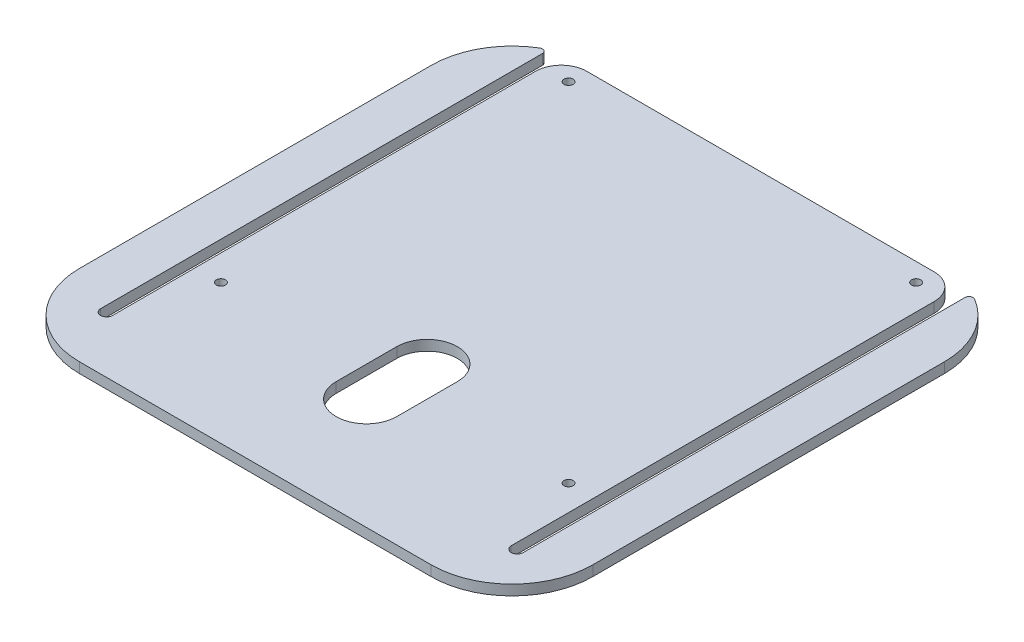
ISO-10303-21;
HEADER;
FILE_DESCRIPTION(('STEP AP214'),'2;1');
FILE_NAME('part.step','',(''),(''),'','','');
FILE_SCHEMA(('AUTOMOTIVE_DESIGN { 1 0 10303 214 1 1 1 1 }'));
ENDSEC;
DATA;
#1=APPLICATION_CONTEXT('core data for automotive mechanical design processes');
#2=APPLICATION_PROTOCOL_DEFINITION('international standard','automotive_design',2000,#1);
#3=PRODUCT_CONTEXT('',#1,'mechanical');
#4=PRODUCT('Part','Part','',(#3));
#5=PRODUCT_RELATED_PRODUCT_CATEGORY('part','',(#4));
#6=PRODUCT_DEFINITION_FORMATION('','',#4);
#7=PRODUCT_DEFINITION_CONTEXT('part definition',#1,'design');
#8=PRODUCT_DEFINITION('design','',#6,#7);
#9=PRODUCT_DEFINITION_SHAPE('','',#8);
#10=(LENGTH_UNIT() NAMED_UNIT(*) SI_UNIT(.MILLI.,.METRE.));
#11=(NAMED_UNIT(*) PLANE_ANGLE_UNIT() SI_UNIT($,.RADIAN.));
#12=(NAMED_UNIT(*) SI_UNIT($,.STERADIAN.) SOLID_ANGLE_UNIT());
#13=UNCERTAINTY_MEASURE_WITH_UNIT(LENGTH_MEASURE(1.E-05),#10,'distance_accuracy_value','');
#14=(GEOMETRIC_REPRESENTATION_CONTEXT(3) GLOBAL_UNCERTAINTY_ASSIGNED_CONTEXT((#13)) GLOBAL_UNIT_ASSIGNED_CONTEXT((#10,
#11,#12)) REPRESENTATION_CONTEXT('',''));
#15=CARTESIAN_POINT('',(0.,0.,0.));
#16=DIRECTION('',(0.,0.,1.));
#17=DIRECTION('',(1.,0.,0.));
#18=AXIS2_PLACEMENT_3D('',#15,#16,#17);
#19=CARTESIAN_POINT('',(0.,2.54,0.));
#20=DIRECTION('',(0.,0.,-1.));
#21=DIRECTION('',(-1.,0.,0.));
#22=AXIS2_PLACEMENT_3D('',#19,#20,#21);
#23=PLANE('',#22);
#24=DIRECTION('',(1.,0.,0.));
#25=VECTOR('',#24,1.);
#26=CARTESIAN_POINT('',(0.,0.,0.));
#27=LINE('',#26,#25);
#28=CARTESIAN_POINT('',(20.525,0.,0.));
#29=VERTEX_POINT('',#28);
#30=CARTESIAN_POINT('',(106.475,0.,0.));
#31=VERTEX_POINT('',#30);
#32=EDGE_CURVE('E283',#29,#31,#27,.T.);
#33=ORIENTED_EDGE('',*,*,#32,.F.);
#34=DIRECTION('',(0.,-1.,0.));
#35=VECTOR('',#34,1.);
#36=CARTESIAN_POINT('',(20.525,2.54,0.));
#37=LINE('',#36,#35);
#38=CARTESIAN_POINT('',(20.525,2.54,0.));
#39=VERTEX_POINT('',#38);
#40=EDGE_CURVE('E401',#29,#39,#37,.F.);
#41=ORIENTED_EDGE('',*,*,#40,.T.);
#42=DIRECTION('',(1.,0.,0.));
#43=VECTOR('',#42,1.);
#44=CARTESIAN_POINT('',(0.,2.54,0.));
#45=LINE('',#44,#43);
#46=CARTESIAN_POINT('',(106.475,2.54,0.));
#47=VERTEX_POINT('',#46);
#48=EDGE_CURVE('E232',#39,#47,#45,.T.);
#49=ORIENTED_EDGE('',*,*,#48,.T.);
#50=DIRECTION('',(0.,-1.,0.));
#51=VECTOR('',#50,1.);
#52=CARTESIAN_POINT('',(106.475,2.54,0.));
#53=LINE('',#52,#51);
#54=EDGE_CURVE('E397',#47,#31,#53,.T.);
#55=ORIENTED_EDGE('',*,*,#54,.T.);
#56=EDGE_LOOP('',(#33,#41,#49,#55));
#57=FACE_BOUND('',#56,.T.);
#58=ADVANCED_FACE('F48',(#57),#23,.T.);
#59=CARTESIAN_POINT('',(14.175,2.54,0.));
#60=DIRECTION('',(1.,0.,0.));
#61=DIRECTION('',(0.,0.,-1.));
#62=AXIS2_PLACEMENT_3D('',#59,#60,#61);
#63=PLANE('',#62);
#64=DIRECTION('',(0.,0.,1.));
#65=VECTOR('',#64,1.);
#66=CARTESIAN_POINT('',(14.175,2.54,0.));
#67=LINE('',#66,#65);
#68=CARTESIAN_POINT('',(14.175,2.54,6.35));
#69=VERTEX_POINT('',#68);
#70=CARTESIAN_POINT('',(14.175,2.54,111.));
#71=VERTEX_POINT('',#70);
#72=EDGE_CURVE('E236',#69,#71,#67,.T.);
#73=ORIENTED_EDGE('',*,*,#72,.F.);
#74=DIRECTION('',(0.,-1.,0.));
#75=VECTOR('',#74,1.);
#76=CARTESIAN_POINT('',(14.175,0.,6.35));
#77=LINE('',#76,#75);
#78=CARTESIAN_POINT('',(14.175,0.,6.35));
#79=VERTEX_POINT('',#78);
#80=EDGE_CURVE('E387',#69,#79,#77,.T.);
#81=ORIENTED_EDGE('',*,*,#80,.T.);
#82=DIRECTION('',(0.,0.,1.));
#83=VECTOR('',#82,1.);
#84=CARTESIAN_POINT('',(14.175,0.,0.));
#85=LINE('',#84,#83);
#86=CARTESIAN_POINT('',(14.175,0.,111.));
#87=VERTEX_POINT('',#86);
#88=EDGE_CURVE('E287',#79,#87,#85,.T.);
#89=ORIENTED_EDGE('',*,*,#88,.T.);
#90=DIRECTION('',(0.,-1.,0.));
#91=VECTOR('',#90,1.);
#92=CARTESIAN_POINT('',(14.175,2.54,111.));
#93=LINE('',#92,#91);
#94=EDGE_CURVE('E329',#71,#87,#93,.T.);
#95=ORIENTED_EDGE('',*,*,#94,.F.);
#96=EDGE_LOOP('',(#73,#81,#89,#95));
#97=FACE_BOUND('',#96,.T.);
#98=ADVANCED_FACE('F500',(#97),#63,.F.);
#99=CARTESIAN_POINT('',(12.7,2.54,111.));
#100=DIRECTION('',(0.,-1.,0.));
#101=DIRECTION('',(0.,0.,-1.));
#102=AXIS2_PLACEMENT_3D('',#99,#100,#101);
#103=CYLINDRICAL_SURFACE('',#102,1.475);
#104=CARTESIAN_POINT('',(12.7,0.,111.));
#105=DIRECTION('',(0.,1.,0.));
#106=DIRECTION('',(0.,0.,1.));
#107=AXIS2_PLACEMENT_3D('',#104,#105,#106);
#108=CIRCLE('',#107,1.475);
#109=CARTESIAN_POINT('',(11.225,0.,111.));
#110=VERTEX_POINT('',#109);
#111=EDGE_CURVE('E290',#110,#87,#108,.T.);
#112=ORIENTED_EDGE('',*,*,#111,.F.);
#113=DIRECTION('',(0.,-1.,0.));
#114=VECTOR('',#113,1.);
#115=CARTESIAN_POINT('',(11.225,2.54,111.));
#116=LINE('',#115,#114);
#117=CARTESIAN_POINT('',(11.225,2.54,111.));
#118=VERTEX_POINT('',#117);
#119=EDGE_CURVE('E325',#118,#110,#116,.T.);
#120=ORIENTED_EDGE('',*,*,#119,.F.);
#121=CARTESIAN_POINT('',(12.7,2.54,111.));
#122=DIRECTION('',(0.,1.,0.));
#123=DIRECTION('',(0.,0.,1.));
#124=AXIS2_PLACEMENT_3D('',#121,#122,#123);
#125=CIRCLE('',#124,1.475);
#126=EDGE_CURVE('E239',#118,#71,#125,.T.);
#127=ORIENTED_EDGE('',*,*,#126,.T.);
#128=ORIENTED_EDGE('',*,*,#94,.T.);
#129=EDGE_LOOP('',(#112,#120,#127,#128));
#130=FACE_BOUND('',#129,.T.);
#131=ADVANCED_FACE('F506',(#130),#103,.F.);
#132=CARTESIAN_POINT('',(11.225,2.54,0.));
#133=DIRECTION('',(1.,0.,0.));
#134=DIRECTION('',(0.,0.,-1.));
#135=AXIS2_PLACEMENT_3D('',#132,#133,#134);
#136=PLANE('',#135);
#137=DIRECTION('',(0.,0.,1.));
#138=VECTOR('',#137,1.);
#139=CARTESIAN_POINT('',(11.225,0.,0.));
#140=LINE('',#139,#138);
#141=CARTESIAN_POINT('',(11.225,0.,1.67956617456544));
#142=VERTEX_POINT('',#141);
#143=EDGE_CURVE('E294',#142,#110,#140,.T.);
#144=ORIENTED_EDGE('',*,*,#143,.F.);
#145=DIRECTION('',(0.,-1.,0.));
#146=VECTOR('',#145,1.);
#147=CARTESIAN_POINT('',(11.225,2.54,1.67956617456544));
#148=LINE('',#147,#146);
#149=CARTESIAN_POINT('',(11.225,2.54,1.67956617456544));
#150=VERTEX_POINT('',#149);
#151=EDGE_CURVE('E11',#142,#150,#148,.F.);
#152=ORIENTED_EDGE('',*,*,#151,.T.);
#153=DIRECTION('',(0.,0.,1.));
#154=VECTOR('',#153,1.);
#155=CARTESIAN_POINT('',(11.225,2.54,0.));
#156=LINE('',#155,#154);
#157=EDGE_CURVE('E243',#150,#118,#156,.T.);
#158=ORIENTED_EDGE('',*,*,#157,.T.);
#159=ORIENTED_EDGE('',*,*,#119,.T.);
#160=EDGE_LOOP('',(#144,#152,#158,#159));
#161=FACE_BOUND('',#160,.T.);
#162=ADVANCED_FACE('F507',(#161),#136,.T.);
#163=CARTESIAN_POINT('',(0.,2.54,0.));
#164=DIRECTION('',(1.,0.,0.));
#165=DIRECTION('',(0.,0.,-1.));
#166=AXIS2_PLACEMENT_3D('',#163,#164,#165);
#167=PLANE('',#166);
#168=DIRECTION('',(0.,0.,1.));
#169=VECTOR('',#168,1.);
#170=CARTESIAN_POINT('',(0.,2.54,0.));
#171=LINE('',#170,#169);
#172=CARTESIAN_POINT('',(0.,2.54,17.9721833676379));
#173=VERTEX_POINT('',#172);
#174=CARTESIAN_POINT('',(0.,2.54,105.));
#175=VERTEX_POINT('',#174);
#176=EDGE_CURVE('E246',#173,#175,#171,.T.);
#177=ORIENTED_EDGE('',*,*,#176,.F.);
#178=DIRECTION('',(0.,-1.,0.));
#179=VECTOR('',#178,1.);
#180=CARTESIAN_POINT('',(0.,2.54,17.9721833676379));
#181=LINE('',#180,#179);
#182=CARTESIAN_POINT('',(0.,0.,17.9721833676379));
#183=VERTEX_POINT('',#182);
#184=EDGE_CURVE('E343',#173,#183,#181,.T.);
#185=ORIENTED_EDGE('',*,*,#184,.T.);
#186=DIRECTION('',(0.,0.,1.));
#187=VECTOR('',#186,1.);
#188=CARTESIAN_POINT('',(0.,0.,0.));
#189=LINE('',#188,#187);
#190=CARTESIAN_POINT('',(0.,0.,105.));
#191=VERTEX_POINT('',#190);
#192=EDGE_CURVE('E297',#183,#191,#189,.T.);
#193=ORIENTED_EDGE('',*,*,#192,.T.);
#194=DIRECTION('',(0.,-1.,0.));
#195=VECTOR('',#194,1.);
#196=CARTESIAN_POINT('',(0.,2.54,105.));
#197=LINE('',#196,#195);
#198=EDGE_CURVE('E333',#191,#175,#197,.F.);
#199=ORIENTED_EDGE('',*,*,#198,.T.);
#200=EDGE_LOOP('',(#177,#185,#193,#199));
#201=FACE_BOUND('',#200,.T.);
#202=ADVANCED_FACE('F445',(#201),#167,.F.);
#203=CARTESIAN_POINT('',(0.,2.54,125.));
#204=DIRECTION('',(0.,0.,-1.));
#205=DIRECTION('',(-1.,0.,0.));
#206=AXIS2_PLACEMENT_3D('',#203,#204,#205);
#207=PLANE('',#206);
#208=DIRECTION('',(1.,0.,0.));
#209=VECTOR('',#208,1.);
#210=CARTESIAN_POINT('',(0.,0.,125.));
#211=LINE('',#210,#209);
#212=CARTESIAN_POINT('',(20.,0.,125.));
#213=VERTEX_POINT('',#212);
#214=CARTESIAN_POINT('',(107.,0.,125.));
#215=VERTEX_POINT('',#214);
#216=EDGE_CURVE('E301',#213,#215,#211,.T.);
#217=ORIENTED_EDGE('',*,*,#216,.T.);
#218=DIRECTION('',(0.,-1.,0.));
#219=VECTOR('',#218,1.);
#220=CARTESIAN_POINT('',(107.,2.54,125.));
#221=LINE('',#220,#219);
#222=CARTESIAN_POINT('',(107.,2.54,125.));
#223=VERTEX_POINT('',#222);
#224=EDGE_CURVE('E384',#215,#223,#221,.F.);
#225=ORIENTED_EDGE('',*,*,#224,.T.);
#226=DIRECTION('',(1.,0.,0.));
#227=VECTOR('',#226,1.);
#228=CARTESIAN_POINT('',(0.,2.54,125.));
#229=LINE('',#228,#227);
#230=CARTESIAN_POINT('',(20.,2.54,125.));
#231=VERTEX_POINT('',#230);
#232=EDGE_CURVE('E250',#231,#223,#229,.T.);
#233=ORIENTED_EDGE('',*,*,#232,.F.);
#234=DIRECTION('',(0.,-1.,0.));
#235=VECTOR('',#234,1.);
#236=CARTESIAN_POINT('',(20.,2.54,125.));
#237=LINE('',#236,#235);
#238=EDGE_CURVE('E380',#231,#213,#237,.T.);
#239=ORIENTED_EDGE('',*,*,#238,.T.);
#240=EDGE_LOOP('',(#217,#225,#233,#239));
#241=FACE_BOUND('',#240,.T.);
#242=ADVANCED_FACE('F453',(#241),#207,.F.);
#243=CARTESIAN_POINT('',(127.,2.54,0.));
#244=DIRECTION('',(1.,0.,0.));
#245=DIRECTION('',(0.,0.,-1.));
#246=AXIS2_PLACEMENT_3D('',#243,#244,#245);
#247=PLANE('',#246);
#248=DIRECTION('',(0.,0.,1.));
#249=VECTOR('',#248,1.);
#250=CARTESIAN_POINT('',(127.,0.,0.));
#251=LINE('',#250,#249);
#252=CARTESIAN_POINT('',(127.,0.,17.9721833676379));
#253=VERTEX_POINT('',#252);
#254=CARTESIAN_POINT('',(127.,0.,105.));
#255=VERTEX_POINT('',#254);
#256=EDGE_CURVE('E305',#253,#255,#251,.T.);
#257=ORIENTED_EDGE('',*,*,#256,.F.);
#258=DIRECTION('',(0.,1.,0.));
#259=VECTOR('',#258,1.);
#260=CARTESIAN_POINT('',(127.,2.54,17.9721833676379));
#261=LINE('',#260,#259);
#262=CARTESIAN_POINT('',(127.,2.54,17.9721833676379));
#263=VERTEX_POINT('',#262);
#264=EDGE_CURVE('E377',#253,#263,#261,.T.);
#265=ORIENTED_EDGE('',*,*,#264,.T.);
#266=DIRECTION('',(0.,0.,1.));
#267=VECTOR('',#266,1.);
#268=CARTESIAN_POINT('',(127.,2.54,0.));
#269=LINE('',#268,#267);
#270=CARTESIAN_POINT('',(127.,2.54,105.));
#271=VERTEX_POINT('',#270);
#272=EDGE_CURVE('E254',#263,#271,#269,.T.);
#273=ORIENTED_EDGE('',*,*,#272,.T.);
#274=DIRECTION('',(0.,-1.,0.));
#275=VECTOR('',#274,1.);
#276=CARTESIAN_POINT('',(127.,0.,105.));
#277=LINE('',#276,#275);
#278=EDGE_CURVE('E373',#271,#255,#277,.T.);
#279=ORIENTED_EDGE('',*,*,#278,.T.);
#280=EDGE_LOOP('',(#257,#265,#273,#279));
#281=FACE_BOUND('',#280,.T.);
#282=ADVANCED_FACE('F462',(#281),#247,.T.);
#283=CARTESIAN_POINT('',(115.775,2.54,0.));
#284=DIRECTION('',(1.,0.,0.));
#285=DIRECTION('',(0.,0.,-1.));
#286=AXIS2_PLACEMENT_3D('',#283,#284,#285);
#287=PLANE('',#286);
#288=DIRECTION('',(0.,0.,1.));
#289=VECTOR('',#288,1.);
#290=CARTESIAN_POINT('',(115.775,2.54,0.));
#291=LINE('',#290,#289);
#292=CARTESIAN_POINT('',(115.775,2.54,1.67956617456544));
#293=VERTEX_POINT('',#292);
#294=CARTESIAN_POINT('',(115.775,2.54,111.));
#295=VERTEX_POINT('',#294);
#296=EDGE_CURVE('E258',#293,#295,#291,.T.);
#297=ORIENTED_EDGE('',*,*,#296,.F.);
#298=DIRECTION('',(0.,1.,0.));
#299=VECTOR('',#298,1.);
#300=CARTESIAN_POINT('',(115.775,0.,1.67956617456544));
#301=LINE('',#300,#299);
#302=CARTESIAN_POINT('',(115.775,0.,1.67956617456544));
#303=VERTEX_POINT('',#302);
#304=EDGE_CURVE('E413',#293,#303,#301,.F.);
#305=ORIENTED_EDGE('',*,*,#304,.T.);
#306=DIRECTION('',(0.,0.,1.));
#307=VECTOR('',#306,1.);
#308=CARTESIAN_POINT('',(115.775,0.,0.));
#309=LINE('',#308,#307);
#310=CARTESIAN_POINT('',(115.775,0.,111.));
#311=VERTEX_POINT('',#310);
#312=EDGE_CURVE('E309',#303,#311,#309,.T.);
#313=ORIENTED_EDGE('',*,*,#312,.T.);
#314=DIRECTION('',(0.,-1.,0.));
#315=VECTOR('',#314,1.);
#316=CARTESIAN_POINT('',(115.775,2.54,111.));
#317=LINE('',#316,#315);
#318=EDGE_CURVE('E321',#295,#311,#317,.T.);
#319=ORIENTED_EDGE('',*,*,#318,.F.);
#320=EDGE_LOOP('',(#297,#305,#313,#319));
#321=FACE_BOUND('',#320,.T.);
#322=ADVANCED_FACE('F474',(#321),#287,.F.);
#323=CARTESIAN_POINT('',(114.3,2.54,111.));
#324=DIRECTION('',(0.,-1.,0.));
#325=DIRECTION('',(0.,0.,-1.));
#326=AXIS2_PLACEMENT_3D('',#323,#324,#325);
#327=CYLINDRICAL_SURFACE('',#326,1.47500000000002);
#328=CARTESIAN_POINT('',(114.3,0.,111.));
#329=DIRECTION('',(0.,1.,0.));
#330=DIRECTION('',(0.,0.,1.));
#331=AXIS2_PLACEMENT_3D('',#328,#329,#330);
#332=CIRCLE('',#331,1.47500000000002);
#333=CARTESIAN_POINT('',(112.825,0.,111.));
#334=VERTEX_POINT('',#333);
#335=EDGE_CURVE('E312',#334,#311,#332,.T.);
#336=ORIENTED_EDGE('',*,*,#335,.F.);
#337=DIRECTION('',(0.,-1.,0.));
#338=VECTOR('',#337,1.);
#339=CARTESIAN_POINT('',(112.825,2.54,111.));
#340=LINE('',#339,#338);
#341=CARTESIAN_POINT('',(112.825,2.54,111.));
#342=VERTEX_POINT('',#341);
#343=EDGE_CURVE('E209',#342,#334,#340,.T.);
#344=ORIENTED_EDGE('',*,*,#343,.F.);
#345=CARTESIAN_POINT('',(114.3,2.54,111.));
#346=DIRECTION('',(0.,1.,0.));
#347=DIRECTION('',(0.,0.,1.));
#348=AXIS2_PLACEMENT_3D('',#345,#346,#347);
#349=CIRCLE('',#348,1.47500000000002);
#350=EDGE_CURVE('E261',#342,#295,#349,.T.);
#351=ORIENTED_EDGE('',*,*,#350,.T.);
#352=ORIENTED_EDGE('',*,*,#318,.T.);
#353=EDGE_LOOP('',(#336,#344,#351,#352));
#354=FACE_BOUND('',#353,.T.);
#355=ADVANCED_FACE('F480',(#354),#327,.F.);
#356=CARTESIAN_POINT('',(56.,2.54,0.));
#357=DIRECTION('',(1.,0.,0.));
#358=DIRECTION('',(0.,0.,-1.));
#359=AXIS2_PLACEMENT_3D('',#356,#357,#358);
#360=PLANE('',#359);
#361=DIRECTION('',(0.,0.,1.));
#362=VECTOR('',#361,1.);
#363=CARTESIAN_POINT('',(56.,0.,0.));
#364=LINE('',#363,#362);
#365=CARTESIAN_POINT('',(56.,0.,82.5));
#366=VERTEX_POINT('',#365);
#367=CARTESIAN_POINT('',(56.,0.,97.5));
#368=VERTEX_POINT('',#367);
#369=EDGE_CURVE('E203',#366,#368,#364,.T.);
#370=ORIENTED_EDGE('',*,*,#369,.F.);
#371=DIRECTION('',(0.,-1.,0.));
#372=VECTOR('',#371,1.);
#373=CARTESIAN_POINT('',(56.,2.54,82.5));
#374=LINE('',#373,#372);
#375=CARTESIAN_POINT('',(56.,2.54,82.5));
#376=VERTEX_POINT('',#375);
#377=EDGE_CURVE('E197',#376,#366,#374,.T.);
#378=ORIENTED_EDGE('',*,*,#377,.F.);
#379=DIRECTION('',(0.,0.,1.));
#380=VECTOR('',#379,1.);
#381=CARTESIAN_POINT('',(56.,2.54,0.));
#382=LINE('',#381,#380);
#383=CARTESIAN_POINT('',(56.,2.54,97.5));
#384=VERTEX_POINT('',#383);
#385=EDGE_CURVE('E200',#376,#384,#382,.T.);
#386=ORIENTED_EDGE('',*,*,#385,.T.);
#387=DIRECTION('',(0.,-1.,0.));
#388=VECTOR('',#387,1.);
#389=CARTESIAN_POINT('',(56.,2.54,97.5));
#390=LINE('',#389,#388);
#391=EDGE_CURVE('E268',#384,#368,#390,.T.);
#392=ORIENTED_EDGE('',*,*,#391,.T.);
#393=EDGE_LOOP('',(#370,#378,#386,#392));
#394=FACE_BOUND('',#393,.T.);
#395=ADVANCED_FACE('F199',(#394),#360,.T.);
#396=CARTESIAN_POINT('',(63.5,2.54,82.5));
#397=DIRECTION('',(0.,-1.,0.));
#398=DIRECTION('',(0.,0.,-1.));
#399=AXIS2_PLACEMENT_3D('',#396,#397,#398);
#400=CYLINDRICAL_SURFACE('',#399,7.50000000000001);
#401=CARTESIAN_POINT('',(63.5,0.,82.5));
#402=DIRECTION('',(0.,1.,0.));
#403=DIRECTION('',(0.,0.,1.));
#404=AXIS2_PLACEMENT_3D('',#401,#402,#403);
#405=CIRCLE('',#404,7.50000000000001);
#406=CARTESIAN_POINT('',(71.,0.,82.5));
#407=VERTEX_POINT('',#406);
#408=EDGE_CURVE('E271',#407,#366,#405,.T.);
#409=ORIENTED_EDGE('',*,*,#408,.F.);
#410=DIRECTION('',(0.,-1.,0.));
#411=VECTOR('',#410,1.);
#412=CARTESIAN_POINT('',(71.,2.54,82.5));
#413=LINE('',#412,#411);
#414=CARTESIAN_POINT('',(71.,2.54,82.5));
#415=VERTEX_POINT('',#414);
#416=EDGE_CURVE('E210',#415,#407,#413,.T.);
#417=ORIENTED_EDGE('',*,*,#416,.F.);
#418=CARTESIAN_POINT('',(63.5,2.54,82.5));
#419=DIRECTION('',(0.,1.,0.));
#420=DIRECTION('',(0.,0.,1.));
#421=AXIS2_PLACEMENT_3D('',#418,#419,#420);
#422=CIRCLE('',#421,7.50000000000001);
#423=EDGE_CURVE('E215',#415,#376,#422,.T.);
#424=ORIENTED_EDGE('',*,*,#423,.T.);
#425=ORIENTED_EDGE('',*,*,#377,.T.);
#426=EDGE_LOOP('',(#409,#417,#424,#425));
#427=FACE_BOUND('',#426,.T.);
#428=ADVANCED_FACE('F221',(#427),#400,.F.);
#429=CARTESIAN_POINT('',(71.,2.54,0.));
#430=DIRECTION('',(1.,0.,0.));
#431=DIRECTION('',(0.,0.,-1.));
#432=AXIS2_PLACEMENT_3D('',#429,#430,#431);
#433=PLANE('',#432);
#434=DIRECTION('',(0.,0.,1.));
#435=VECTOR('',#434,1.);
#436=CARTESIAN_POINT('',(71.,0.,0.));
#437=LINE('',#436,#435);
#438=CARTESIAN_POINT('',(71.,0.,97.5));
#439=VERTEX_POINT('',#438);
#440=EDGE_CURVE('E275',#407,#439,#437,.T.);
#441=ORIENTED_EDGE('',*,*,#440,.T.);
#442=DIRECTION('',(0.,-1.,0.));
#443=VECTOR('',#442,1.);
#444=CARTESIAN_POINT('',(71.,2.54,97.5));
#445=LINE('',#444,#443);
#446=CARTESIAN_POINT('',(71.,2.54,97.5));
#447=VERTEX_POINT('',#446);
#448=EDGE_CURVE('E336',#447,#439,#445,.T.);
#449=ORIENTED_EDGE('',*,*,#448,.F.);
#450=DIRECTION('',(0.,0.,1.));
#451=VECTOR('',#450,1.);
#452=CARTESIAN_POINT('',(71.,2.54,0.));
#453=LINE('',#452,#451);
#454=EDGE_CURVE('E224',#415,#447,#453,.T.);
#455=ORIENTED_EDGE('',*,*,#454,.F.);
#456=ORIENTED_EDGE('',*,*,#416,.T.);
#457=EDGE_LOOP('',(#441,#449,#455,#456));
#458=FACE_BOUND('',#457,.T.);
#459=ADVANCED_FACE('F530',(#458),#433,.F.);
#460=CARTESIAN_POINT('',(112.825,2.54,0.));
#461=DIRECTION('',(1.,0.,0.));
#462=DIRECTION('',(0.,0.,-1.));
#463=AXIS2_PLACEMENT_3D('',#460,#461,#462);
#464=PLANE('',#463);
#465=DIRECTION('',(0.,0.,1.));
#466=VECTOR('',#465,1.);
#467=CARTESIAN_POINT('',(112.825,0.,0.));
#468=LINE('',#467,#466);
#469=CARTESIAN_POINT('',(112.825,0.,6.35));
#470=VERTEX_POINT('',#469);
#471=EDGE_CURVE('E219',#470,#334,#468,.T.);
#472=ORIENTED_EDGE('',*,*,#471,.F.);
#473=DIRECTION('',(0.,-1.,0.));
#474=VECTOR('',#473,1.);
#475=CARTESIAN_POINT('',(112.825,2.54,6.35));
#476=LINE('',#475,#474);
#477=CARTESIAN_POINT('',(112.825,2.54,6.35));
#478=VERTEX_POINT('',#477);
#479=EDGE_CURVE('E410',#470,#478,#476,.F.);
#480=ORIENTED_EDGE('',*,*,#479,.T.);
#481=DIRECTION('',(0.,0.,1.));
#482=VECTOR('',#481,1.);
#483=CARTESIAN_POINT('',(112.825,2.54,0.));
#484=LINE('',#483,#482);
#485=EDGE_CURVE('E265',#478,#342,#484,.T.);
#486=ORIENTED_EDGE('',*,*,#485,.T.);
#487=ORIENTED_EDGE('',*,*,#343,.T.);
#488=EDGE_LOOP('',(#472,#480,#486,#487));
#489=FACE_BOUND('',#488,.T.);
#490=ADVANCED_FACE('F528',(#489),#464,.T.);
#491=CARTESIAN_POINT('',(63.5,2.54,97.5));
#492=DIRECTION('',(0.,-1.,0.));
#493=DIRECTION('',(0.,0.,-1.));
#494=AXIS2_PLACEMENT_3D('',#491,#492,#493);
#495=CYLINDRICAL_SURFACE('',#494,7.50000000000001);
#496=CARTESIAN_POINT('',(63.5,0.,97.5));
#497=DIRECTION('',(0.,1.,0.));
#498=DIRECTION('',(0.,0.,1.));
#499=AXIS2_PLACEMENT_3D('',#496,#497,#498);
#500=CIRCLE('',#499,7.50000000000001);
#501=EDGE_CURVE('E279',#368,#439,#500,.T.);
#502=ORIENTED_EDGE('',*,*,#501,.F.);
#503=ORIENTED_EDGE('',*,*,#391,.F.);
#504=CARTESIAN_POINT('',(63.5,2.54,97.5));
#505=DIRECTION('',(0.,1.,0.));
#506=DIRECTION('',(0.,0.,1.));
#507=AXIS2_PLACEMENT_3D('',#504,#505,#506);
#508=CIRCLE('',#507,7.50000000000001);
#509=EDGE_CURVE('E217',#384,#447,#508,.T.);
#510=ORIENTED_EDGE('',*,*,#509,.T.);
#511=ORIENTED_EDGE('',*,*,#448,.T.);
#512=EDGE_LOOP('',(#502,#503,#510,#511));
#513=FACE_BOUND('',#512,.T.);
#514=ADVANCED_FACE('F525',(#513),#495,.F.);
#515=CARTESIAN_POINT('',(0.,2.54,0.));
#516=DIRECTION('',(0.,1.,0.));
#517=DIRECTION('',(0.,0.,1.));
#518=AXIS2_PLACEMENT_3D('',#515,#516,#517);
#519=PLANE('',#518);
#520=CARTESIAN_POINT('',(106.5,2.54,4.5));
#521=DIRECTION('',(0.,1.,0.));
#522=DIRECTION('',(0.,0.,1.));
#523=AXIS2_PLACEMENT_3D('',#520,#521,#522);
#524=CIRCLE('',#523,1.1303);
#525=CARTESIAN_POINT('',(106.5,2.54,5.6303));
#526=VERTEX_POINT('',#525);
#527=EDGE_CURVE('E855',#526,#526,#524,.T.);
#528=ORIENTED_EDGE('',*,*,#527,.F.);
#529=EDGE_LOOP('',(#528));
#530=FACE_BOUND('',#529,.T.);
#531=CARTESIAN_POINT('',(20.5,2.54,4.5));
#532=DIRECTION('',(0.,1.,0.));
#533=DIRECTION('',(0.,0.,1.));
#534=AXIS2_PLACEMENT_3D('',#531,#532,#533);
#535=CIRCLE('',#534,1.1303);
#536=CARTESIAN_POINT('',(20.5,2.54,5.6303));
#537=VERTEX_POINT('',#536);
#538=EDGE_CURVE('E859',#537,#537,#535,.T.);
#539=ORIENTED_EDGE('',*,*,#538,.F.);
#540=EDGE_LOOP('',(#539));
#541=FACE_BOUND('',#540,.T.);
#542=CARTESIAN_POINT('',(106.5,2.54,90.5));
#543=DIRECTION('',(0.,1.,0.));
#544=DIRECTION('',(0.,0.,1.));
#545=AXIS2_PLACEMENT_3D('',#542,#543,#544);
#546=CIRCLE('',#545,1.1303);
#547=CARTESIAN_POINT('',(106.5,2.54,91.6303));
#548=VERTEX_POINT('',#547);
#549=EDGE_CURVE('E869',#548,#548,#546,.T.);
#550=ORIENTED_EDGE('',*,*,#549,.F.);
#551=EDGE_LOOP('',(#550));
#552=FACE_BOUND('',#551,.T.);
#553=CARTESIAN_POINT('',(20.5,2.54,90.5));
#554=DIRECTION('',(0.,1.,0.));
#555=DIRECTION('',(0.,0.,1.));
#556=AXIS2_PLACEMENT_3D('',#553,#554,#555);
#557=CIRCLE('',#556,1.1303);
#558=CARTESIAN_POINT('',(20.5,2.54,91.6303));
#559=VERTEX_POINT('',#558);
#560=EDGE_CURVE('E877',#559,#559,#557,.T.);
#561=ORIENTED_EDGE('',*,*,#560,.F.);
#562=EDGE_LOOP('',(#561));
#563=FACE_BOUND('',#562,.T.);
#564=ORIENTED_EDGE('',*,*,#385,.F.);
#565=ORIENTED_EDGE('',*,*,#423,.F.);
#566=ORIENTED_EDGE('',*,*,#454,.T.);
#567=ORIENTED_EDGE('',*,*,#509,.F.);
#568=EDGE_LOOP('',(#564,#565,#566,#567));
#569=FACE_BOUND('',#568,.T.);
#570=CARTESIAN_POINT('',(107.,2.54,17.9721833676379));
#571=DIRECTION('',(0.,1.,0.));
#572=DIRECTION('',(0.,0.,1.));
#573=AXIS2_PLACEMENT_3D('',#570,#571,#572);
#574=CIRCLE('',#573,20.);
#575=CARTESIAN_POINT('',(117.289473684211,2.54,0.822060006508994));
#576=VERTEX_POINT('',#575);
#577=EDGE_CURVE('E366',#263,#576,#574,.T.);
#578=ORIENTED_EDGE('',*,*,#577,.T.);
#579=CARTESIAN_POINT('',(116.775,2.54,1.67956617456544));
#580=DIRECTION('',(0.,1.,0.));
#581=DIRECTION('',(0.,0.,1.));
#582=AXIS2_PLACEMENT_3D('',#579,#580,#581);
#583=CIRCLE('',#582,1.);
#584=EDGE_CURVE('E428',#576,#293,#583,.T.);
#585=ORIENTED_EDGE('',*,*,#584,.T.);
#586=ORIENTED_EDGE('',*,*,#296,.T.);
#587=ORIENTED_EDGE('',*,*,#350,.F.);
#588=ORIENTED_EDGE('',*,*,#485,.F.);
#589=CARTESIAN_POINT('',(106.475,2.54,6.35));
#590=DIRECTION('',(0.,1.,0.));
#591=DIRECTION('',(0.,0.,1.));
#592=AXIS2_PLACEMENT_3D('',#589,#590,#591);
#593=CIRCLE('',#592,6.35);
#594=EDGE_CURVE('E404',#478,#47,#593,.T.);
#595=ORIENTED_EDGE('',*,*,#594,.T.);
#596=ORIENTED_EDGE('',*,*,#48,.F.);
#597=CARTESIAN_POINT('',(20.525,2.54,6.35));
#598=DIRECTION('',(0.,1.,0.));
#599=DIRECTION('',(0.,0.,1.));
#600=AXIS2_PLACEMENT_3D('',#597,#598,#599);
#601=CIRCLE('',#600,6.35);
#602=EDGE_CURVE('E407',#39,#69,#601,.T.);
#603=ORIENTED_EDGE('',*,*,#602,.T.);
#604=ORIENTED_EDGE('',*,*,#72,.T.);
#605=ORIENTED_EDGE('',*,*,#126,.F.);
#606=ORIENTED_EDGE('',*,*,#157,.F.);
#607=CARTESIAN_POINT('',(10.225,2.54,1.67956617456544));
#608=DIRECTION('',(0.,1.,0.));
#609=DIRECTION('',(0.,0.,1.));
#610=AXIS2_PLACEMENT_3D('',#607,#608,#609);
#611=CIRCLE('',#610,1.);
#612=CARTESIAN_POINT('',(9.71052631578947,2.54,0.822060006508991));
#613=VERTEX_POINT('',#612);
#614=EDGE_CURVE('E64',#150,#613,#611,.T.);
#615=ORIENTED_EDGE('',*,*,#614,.T.);
#616=CARTESIAN_POINT('',(20.,2.54,17.9721833676379));
#617=DIRECTION('',(0.,1.,0.));
#618=DIRECTION('',(0.,0.,1.));
#619=AXIS2_PLACEMENT_3D('',#616,#617,#618);
#620=CIRCLE('',#619,20.);
#621=EDGE_CURVE('E370',#613,#173,#620,.T.);
#622=ORIENTED_EDGE('',*,*,#621,.T.);
#623=ORIENTED_EDGE('',*,*,#176,.T.);
#624=CARTESIAN_POINT('',(20.,2.54,105.));
#625=DIRECTION('',(0.,1.,0.));
#626=DIRECTION('',(0.,0.,1.));
#627=AXIS2_PLACEMENT_3D('',#624,#625,#626);
#628=CIRCLE('',#627,20.);
#629=EDGE_CURVE('E360',#175,#231,#628,.T.);
#630=ORIENTED_EDGE('',*,*,#629,.T.);
#631=ORIENTED_EDGE('',*,*,#232,.T.);
#632=CARTESIAN_POINT('',(107.,2.54,105.));
#633=DIRECTION('',(0.,1.,0.));
#634=DIRECTION('',(0.,0.,1.));
#635=AXIS2_PLACEMENT_3D('',#632,#633,#634);
#636=CIRCLE('',#635,20.);
#637=EDGE_CURVE('E363',#223,#271,#636,.T.);
#638=ORIENTED_EDGE('',*,*,#637,.T.);
#639=ORIENTED_EDGE('',*,*,#272,.F.);
#640=EDGE_LOOP('',(#578,#585,#586,#587,#588,#595,#596,#603,#604,#605,#606,#615,#622,#623,#630,
#631,#638,#639));
#641=FACE_BOUND('',#640,.T.);
#642=ADVANCED_FACE('F214',(#530,#541,#552,#563,#569,#641),#519,.T.);
#643=CARTESIAN_POINT('',(0.,0.,0.));
#644=DIRECTION('',(0.,1.,0.));
#645=DIRECTION('',(0.,0.,1.));
#646=AXIS2_PLACEMENT_3D('',#643,#644,#645);
#647=PLANE('',#646);
#648=CARTESIAN_POINT('',(106.5,0.,4.5));
#649=DIRECTION('',(0.,1.,0.));
#650=DIRECTION('',(0.,0.,1.));
#651=AXIS2_PLACEMENT_3D('',#648,#649,#650);
#652=CIRCLE('',#651,1.1303);
#653=CARTESIAN_POINT('',(106.5,0.,5.6303));
#654=VERTEX_POINT('',#653);
#655=EDGE_CURVE('E852',#654,#654,#652,.T.);
#656=ORIENTED_EDGE('',*,*,#655,.T.);
#657=EDGE_LOOP('',(#656));
#658=FACE_BOUND('',#657,.T.);
#659=CARTESIAN_POINT('',(20.5,0.,4.5));
#660=DIRECTION('',(0.,1.,0.));
#661=DIRECTION('',(0.,0.,1.));
#662=AXIS2_PLACEMENT_3D('',#659,#660,#661);
#663=CIRCLE('',#662,1.1303);
#664=CARTESIAN_POINT('',(20.5,0.,5.6303));
#665=VERTEX_POINT('',#664);
#666=EDGE_CURVE('E865',#665,#665,#663,.T.);
#667=ORIENTED_EDGE('',*,*,#666,.T.);
#668=EDGE_LOOP('',(#667));
#669=FACE_BOUND('',#668,.T.);
#670=CARTESIAN_POINT('',(106.5,0.,90.5));
#671=DIRECTION('',(0.,1.,0.));
#672=DIRECTION('',(0.,0.,1.));
#673=AXIS2_PLACEMENT_3D('',#670,#671,#672);
#674=CIRCLE('',#673,1.1303);
#675=CARTESIAN_POINT('',(106.5,0.,91.6303));
#676=VERTEX_POINT('',#675);
#677=EDGE_CURVE('E873',#676,#676,#674,.T.);
#678=ORIENTED_EDGE('',*,*,#677,.T.);
#679=EDGE_LOOP('',(#678));
#680=FACE_BOUND('',#679,.T.);
#681=CARTESIAN_POINT('',(20.5,0.,90.5));
#682=DIRECTION('',(0.,1.,0.));
#683=DIRECTION('',(0.,0.,1.));
#684=AXIS2_PLACEMENT_3D('',#681,#682,#683);
#685=CIRCLE('',#684,1.1303);
#686=CARTESIAN_POINT('',(20.5,0.,91.6303));
#687=VERTEX_POINT('',#686);
#688=EDGE_CURVE('E272',#687,#687,#685,.T.);
#689=ORIENTED_EDGE('',*,*,#688,.T.);
#690=EDGE_LOOP('',(#689));
#691=FACE_BOUND('',#690,.T.);
#692=ORIENTED_EDGE('',*,*,#369,.T.);
#693=ORIENTED_EDGE('',*,*,#501,.T.);
#694=ORIENTED_EDGE('',*,*,#440,.F.);
#695=ORIENTED_EDGE('',*,*,#408,.T.);
#696=EDGE_LOOP('',(#692,#693,#694,#695));
#697=FACE_BOUND('',#696,.T.);
#698=ORIENTED_EDGE('',*,*,#312,.F.);
#699=CARTESIAN_POINT('',(116.775,0.,1.67956617456544));
#700=DIRECTION('',(0.,1.,0.));
#701=DIRECTION('',(0.,0.,1.));
#702=AXIS2_PLACEMENT_3D('',#699,#700,#701);
#703=CIRCLE('',#702,1.);
#704=CARTESIAN_POINT('',(117.289473684211,0.,0.822060006508994));
#705=VERTEX_POINT('',#704);
#706=EDGE_CURVE('E420',#303,#705,#703,.F.);
#707=ORIENTED_EDGE('',*,*,#706,.T.);
#708=CARTESIAN_POINT('',(107.,0.,17.9721833676379));
#709=DIRECTION('',(0.,1.,0.));
#710=DIRECTION('',(0.,0.,1.));
#711=AXIS2_PLACEMENT_3D('',#708,#709,#710);
#712=CIRCLE('',#711,20.);
#713=EDGE_CURVE('E353',#705,#253,#712,.F.);
#714=ORIENTED_EDGE('',*,*,#713,.T.);
#715=ORIENTED_EDGE('',*,*,#256,.T.);
#716=CARTESIAN_POINT('',(107.,0.,105.));
#717=DIRECTION('',(0.,1.,0.));
#718=DIRECTION('',(0.,0.,1.));
#719=AXIS2_PLACEMENT_3D('',#716,#717,#718);
#720=CIRCLE('',#719,20.);
#721=EDGE_CURVE('E350',#255,#215,#720,.F.);
#722=ORIENTED_EDGE('',*,*,#721,.T.);
#723=ORIENTED_EDGE('',*,*,#216,.F.);
#724=CARTESIAN_POINT('',(20.,0.,105.));
#725=DIRECTION('',(0.,1.,0.));
#726=DIRECTION('',(0.,0.,1.));
#727=AXIS2_PLACEMENT_3D('',#724,#725,#726);
#728=CIRCLE('',#727,20.);
#729=EDGE_CURVE('E347',#213,#191,#728,.F.);
#730=ORIENTED_EDGE('',*,*,#729,.T.);
#731=ORIENTED_EDGE('',*,*,#192,.F.);
#732=CARTESIAN_POINT('',(20.,0.,17.9721833676379));
#733=DIRECTION('',(0.,1.,0.));
#734=DIRECTION('',(0.,0.,1.));
#735=AXIS2_PLACEMENT_3D('',#732,#733,#734);
#736=CIRCLE('',#735,20.);
#737=CARTESIAN_POINT('',(9.71052631578947,0.,0.822060006508991));
#738=VERTEX_POINT('',#737);
#739=EDGE_CURVE('E356',#183,#738,#736,.F.);
#740=ORIENTED_EDGE('',*,*,#739,.T.);
#741=CARTESIAN_POINT('',(10.225,0.,1.67956617456544));
#742=DIRECTION('',(0.,1.,0.));
#743=DIRECTION('',(0.,0.,1.));
#744=AXIS2_PLACEMENT_3D('',#741,#742,#743);
#745=CIRCLE('',#744,1.);
#746=EDGE_CURVE('E417',#738,#142,#745,.F.);
#747=ORIENTED_EDGE('',*,*,#746,.T.);
#748=ORIENTED_EDGE('',*,*,#143,.T.);
#749=ORIENTED_EDGE('',*,*,#111,.T.);
#750=ORIENTED_EDGE('',*,*,#88,.F.);
#751=CARTESIAN_POINT('',(20.525,0.,6.35));
#752=DIRECTION('',(0.,1.,0.));
#753=DIRECTION('',(0.,0.,1.));
#754=AXIS2_PLACEMENT_3D('',#751,#752,#753);
#755=CIRCLE('',#754,6.35);
#756=EDGE_CURVE('E394',#79,#29,#755,.F.);
#757=ORIENTED_EDGE('',*,*,#756,.T.);
#758=ORIENTED_EDGE('',*,*,#32,.T.);
#759=CARTESIAN_POINT('',(106.475,0.,6.35));
#760=DIRECTION('',(0.,1.,0.));
#761=DIRECTION('',(0.,0.,1.));
#762=AXIS2_PLACEMENT_3D('',#759,#760,#761);
#763=CIRCLE('',#762,6.35);
#764=EDGE_CURVE('E391',#31,#470,#763,.F.);
#765=ORIENTED_EDGE('',*,*,#764,.T.);
#766=ORIENTED_EDGE('',*,*,#471,.T.);
#767=ORIENTED_EDGE('',*,*,#335,.T.);
#768=EDGE_LOOP('',(#698,#707,#714,#715,#722,#723,#730,#731,#740,#747,#748,#749,#750,#757,#758,
#765,#766,#767));
#769=FACE_BOUND('',#768,.T.);
#770=ADVANCED_FACE('F440',(#658,#669,#680,#691,#697,#769),#647,.F.);
#771=CARTESIAN_POINT('',(20.,2.54,17.9721833676379));
#772=DIRECTION('',(0.,-1.,0.));
#773=DIRECTION('',(0.,0.,-1.));
#774=AXIS2_PLACEMENT_3D('',#771,#772,#773);
#775=CYLINDRICAL_SURFACE('',#774,20.);
#776=ORIENTED_EDGE('',*,*,#621,.F.);
#777=DIRECTION('',(0.,-1.,0.));
#778=VECTOR('',#777,1.);
#779=CARTESIAN_POINT('',(9.71052631578947,2.54,0.822060006508991));
#780=LINE('',#779,#778);
#781=EDGE_CURVE('E57',#613,#738,#780,.T.);
#782=ORIENTED_EDGE('',*,*,#781,.T.);
#783=ORIENTED_EDGE('',*,*,#739,.F.);
#784=ORIENTED_EDGE('',*,*,#184,.F.);
#785=EDGE_LOOP('',(#776,#782,#783,#784));
#786=FACE_BOUND('',#785,.T.);
#787=ADVANCED_FACE('F434',(#786),#775,.T.);
#788=CARTESIAN_POINT('',(107.,2.54,17.9721833676379));
#789=DIRECTION('',(0.,-1.,0.));
#790=DIRECTION('',(0.,0.,-1.));
#791=AXIS2_PLACEMENT_3D('',#788,#789,#790);
#792=CYLINDRICAL_SURFACE('',#791,20.);
#793=ORIENTED_EDGE('',*,*,#713,.F.);
#794=DIRECTION('',(0.,-1.,0.));
#795=VECTOR('',#794,1.);
#796=CARTESIAN_POINT('',(117.289473684211,2.54,0.822060006508994));
#797=LINE('',#796,#795);
#798=EDGE_CURVE('E423',#705,#576,#797,.F.);
#799=ORIENTED_EDGE('',*,*,#798,.T.);
#800=ORIENTED_EDGE('',*,*,#577,.F.);
#801=ORIENTED_EDGE('',*,*,#264,.F.);
#802=EDGE_LOOP('',(#793,#799,#800,#801));
#803=FACE_BOUND('',#802,.T.);
#804=ADVANCED_FACE('F466',(#803),#792,.T.);
#805=CARTESIAN_POINT('',(107.,2.54,105.));
#806=DIRECTION('',(0.,1.,0.));
#807=DIRECTION('',(0.,0.,1.));
#808=AXIS2_PLACEMENT_3D('',#805,#806,#807);
#809=CYLINDRICAL_SURFACE('',#808,20.);
#810=ORIENTED_EDGE('',*,*,#637,.F.);
#811=ORIENTED_EDGE('',*,*,#224,.F.);
#812=ORIENTED_EDGE('',*,*,#721,.F.);
#813=ORIENTED_EDGE('',*,*,#278,.F.);
#814=EDGE_LOOP('',(#810,#811,#812,#813));
#815=FACE_BOUND('',#814,.T.);
#816=ADVANCED_FACE('F456',(#815),#809,.T.);
#817=CARTESIAN_POINT('',(20.,2.54,105.));
#818=DIRECTION('',(0.,-1.,0.));
#819=DIRECTION('',(0.,0.,-1.));
#820=AXIS2_PLACEMENT_3D('',#817,#818,#819);
#821=CYLINDRICAL_SURFACE('',#820,20.);
#822=ORIENTED_EDGE('',*,*,#629,.F.);
#823=ORIENTED_EDGE('',*,*,#198,.F.);
#824=ORIENTED_EDGE('',*,*,#729,.F.);
#825=ORIENTED_EDGE('',*,*,#238,.F.);
#826=EDGE_LOOP('',(#822,#823,#824,#825));
#827=FACE_BOUND('',#826,.T.);
#828=ADVANCED_FACE('F448',(#827),#821,.T.);
#829=CARTESIAN_POINT('',(20.525,2.54,6.35));
#830=DIRECTION('',(0.,1.,0.));
#831=DIRECTION('',(0.,0.,1.));
#832=AXIS2_PLACEMENT_3D('',#829,#830,#831);
#833=CYLINDRICAL_SURFACE('',#832,6.35);
#834=ORIENTED_EDGE('',*,*,#602,.F.);
#835=ORIENTED_EDGE('',*,*,#40,.F.);
#836=ORIENTED_EDGE('',*,*,#756,.F.);
#837=ORIENTED_EDGE('',*,*,#80,.F.);
#838=EDGE_LOOP('',(#834,#835,#836,#837));
#839=FACE_BOUND('',#838,.T.);
#840=ADVANCED_FACE('F497',(#839),#833,.T.);
#841=CARTESIAN_POINT('',(106.475,2.54,6.35));
#842=DIRECTION('',(0.,-1.,0.));
#843=DIRECTION('',(0.,0.,-1.));
#844=AXIS2_PLACEMENT_3D('',#841,#842,#843);
#845=CYLINDRICAL_SURFACE('',#844,6.35);
#846=ORIENTED_EDGE('',*,*,#594,.F.);
#847=ORIENTED_EDGE('',*,*,#479,.F.);
#848=ORIENTED_EDGE('',*,*,#764,.F.);
#849=ORIENTED_EDGE('',*,*,#54,.F.);
#850=EDGE_LOOP('',(#846,#847,#848,#849));
#851=FACE_BOUND('',#850,.T.);
#852=ADVANCED_FACE('F489',(#851),#845,.T.);
#853=CARTESIAN_POINT('',(116.775,2.54,1.67956617456544));
#854=DIRECTION('',(0.,-1.,0.));
#855=DIRECTION('',(0.,0.,-1.));
#856=AXIS2_PLACEMENT_3D('',#853,#854,#855);
#857=CYLINDRICAL_SURFACE('',#856,1.);
#858=ORIENTED_EDGE('',*,*,#584,.F.);
#859=ORIENTED_EDGE('',*,*,#798,.F.);
#860=ORIENTED_EDGE('',*,*,#706,.F.);
#861=ORIENTED_EDGE('',*,*,#304,.F.);
#862=EDGE_LOOP('',(#858,#859,#860,#861));
#863=FACE_BOUND('',#862,.T.);
#864=ADVANCED_FACE('F472',(#863),#857,.T.);
#865=CARTESIAN_POINT('',(10.225,2.54,1.67956617456544));
#866=DIRECTION('',(0.,-1.,0.));
#867=DIRECTION('',(0.,0.,-1.));
#868=AXIS2_PLACEMENT_3D('',#865,#866,#867);
#869=CYLINDRICAL_SURFACE('',#868,1.);
#870=ORIENTED_EDGE('',*,*,#614,.F.);
#871=ORIENTED_EDGE('',*,*,#151,.F.);
#872=ORIENTED_EDGE('',*,*,#746,.F.);
#873=ORIENTED_EDGE('',*,*,#781,.F.);
#874=EDGE_LOOP('',(#870,#871,#872,#873));
#875=FACE_BOUND('',#874,.T.);
#876=ADVANCED_FACE('F50',(#875),#869,.T.);
#877=CARTESIAN_POINT('',(20.5,2.54,90.5));
#878=DIRECTION('',(0.,1.,0.));
#879=DIRECTION('',(0.,0.,1.));
#880=AXIS2_PLACEMENT_3D('',#877,#878,#879);
#881=CYLINDRICAL_SURFACE('',#880,1.1303);
#882=ORIENTED_EDGE('',*,*,#688,.F.);
#883=EDGE_LOOP('',(#882));
#884=FACE_BOUND('',#883,.T.);
#885=ORIENTED_EDGE('',*,*,#560,.T.);
#886=EDGE_LOOP('',(#885));
#887=FACE_BOUND('',#886,.T.);
#888=ADVANCED_FACE('F509',(#884,#887),#881,.F.);
#889=CARTESIAN_POINT('',(106.5,2.54,90.5));
#890=DIRECTION('',(0.,1.,0.));
#891=DIRECTION('',(0.,0.,1.));
#892=AXIS2_PLACEMENT_3D('',#889,#890,#891);
#893=CYLINDRICAL_SURFACE('',#892,1.1303);
#894=ORIENTED_EDGE('',*,*,#677,.F.);
#895=EDGE_LOOP('',(#894));
#896=FACE_BOUND('',#895,.T.);
#897=ORIENTED_EDGE('',*,*,#549,.T.);
#898=EDGE_LOOP('',(#897));
#899=FACE_BOUND('',#898,.T.);
#900=ADVANCED_FACE('F514',(#896,#899),#893,.F.);
#901=CARTESIAN_POINT('',(20.5,2.54,4.5));
#902=DIRECTION('',(0.,1.,0.));
#903=DIRECTION('',(0.,0.,1.));
#904=AXIS2_PLACEMENT_3D('',#901,#902,#903);
#905=CYLINDRICAL_SURFACE('',#904,1.1303);
#906=ORIENTED_EDGE('',*,*,#666,.F.);
#907=EDGE_LOOP('',(#906));
#908=FACE_BOUND('',#907,.T.);
#909=ORIENTED_EDGE('',*,*,#538,.T.);
#910=EDGE_LOOP('',(#909));
#911=FACE_BOUND('',#910,.T.);
#912=ADVANCED_FACE('F612',(#908,#911),#905,.F.);
#913=CARTESIAN_POINT('',(106.5,2.54,4.5));
#914=DIRECTION('',(0.,1.,0.));
#915=DIRECTION('',(0.,0.,1.));
#916=AXIS2_PLACEMENT_3D('',#913,#914,#915);
#917=CYLINDRICAL_SURFACE('',#916,1.1303);
#918=ORIENTED_EDGE('',*,*,#655,.F.);
#919=EDGE_LOOP('',(#918));
#920=FACE_BOUND('',#919,.T.);
#921=ORIENTED_EDGE('',*,*,#527,.T.);
#922=EDGE_LOOP('',(#921));
#923=FACE_BOUND('',#922,.T.);
#924=ADVANCED_FACE('F624',(#920,#923),#917,.F.);
#925=CLOSED_SHELL('',(#58,#98,#131,#162,#202,#242,#282,#322,#355,#395,#428,#459,#490,#514,#642,
#770,#787,#804,#816,#828,#840,#852,#864,#876,#888,#900,#912,#924));
#926=MANIFOLD_SOLID_BREP('B2',#925);
#927=ADVANCED_BREP_SHAPE_REPRESENTATION('',(#18,#926),#14);
#928=SHAPE_DEFINITION_REPRESENTATION(#9,#927);
ENDSEC;
END-ISO-10303-21;
